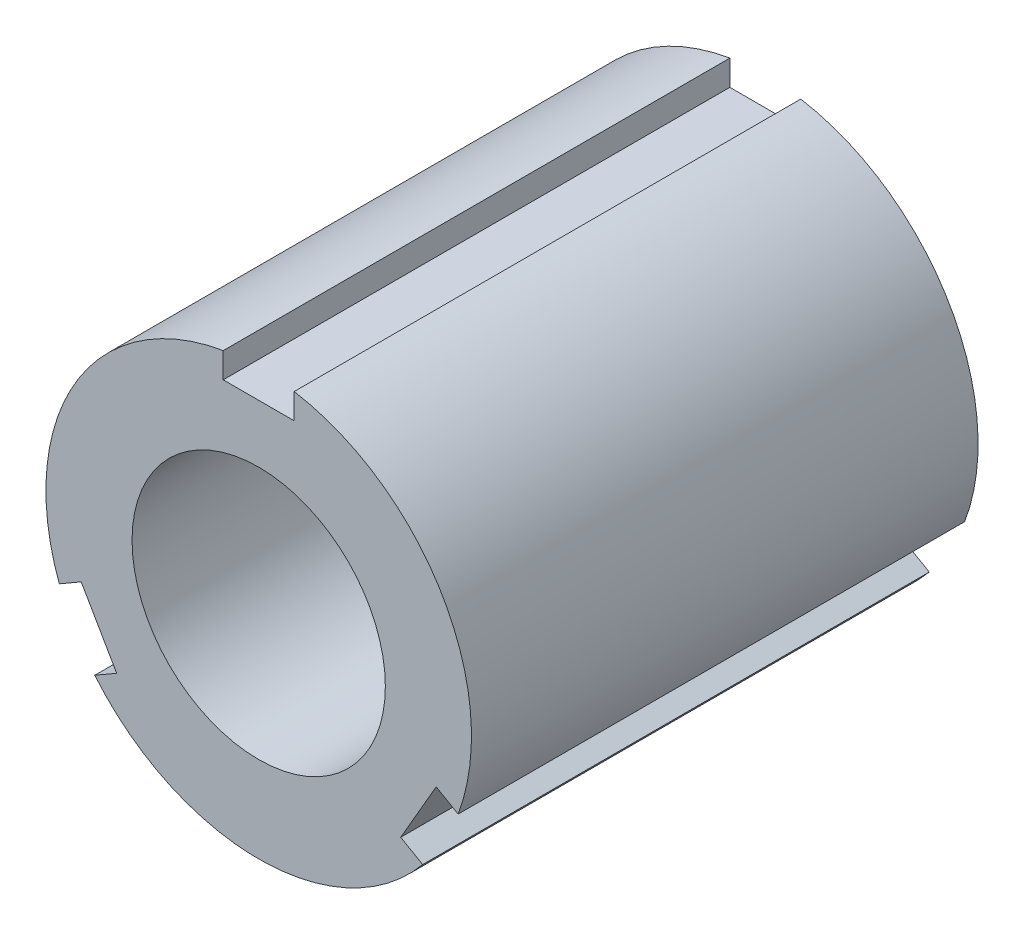
ISO-10303-21;
HEADER;
FILE_DESCRIPTION(('STEP AP214'),'2;1');
FILE_NAME('part.step','',(''),(''),'','','');
FILE_SCHEMA(('AUTOMOTIVE_DESIGN { 1 0 10303 214 1 1 1 1 }'));
ENDSEC;
DATA;
#1=APPLICATION_CONTEXT('core data for automotive mechanical design processes');
#2=APPLICATION_PROTOCOL_DEFINITION('international standard','automotive_design',2000,#1);
#3=PRODUCT_CONTEXT('',#1,'mechanical');
#4=PRODUCT('Part','Part','',(#3));
#5=PRODUCT_RELATED_PRODUCT_CATEGORY('part','',(#4));
#6=PRODUCT_DEFINITION_FORMATION('','',#4);
#7=PRODUCT_DEFINITION_CONTEXT('part definition',#1,'design');
#8=PRODUCT_DEFINITION('design','',#6,#7);
#9=PRODUCT_DEFINITION_SHAPE('','',#8);
#10=(LENGTH_UNIT() NAMED_UNIT(*) SI_UNIT(.MILLI.,.METRE.));
#11=(NAMED_UNIT(*) PLANE_ANGLE_UNIT() SI_UNIT($,.RADIAN.));
#12=(NAMED_UNIT(*) SI_UNIT($,.STERADIAN.) SOLID_ANGLE_UNIT());
#13=UNCERTAINTY_MEASURE_WITH_UNIT(LENGTH_MEASURE(1.E-05),#10,'distance_accuracy_value','');
#14=(GEOMETRIC_REPRESENTATION_CONTEXT(3) GLOBAL_UNCERTAINTY_ASSIGNED_CONTEXT((#13)) GLOBAL_UNIT_ASSIGNED_CONTEXT((#10,
#11,#12)) REPRESENTATION_CONTEXT('',''));
#15=CARTESIAN_POINT('',(0.,0.,0.));
#16=DIRECTION('',(0.,0.,1.));
#17=DIRECTION('',(1.,0.,0.));
#18=AXIS2_PLACEMENT_3D('',#15,#16,#17);
#19=CARTESIAN_POINT('',(-3.5,0.,50.));
#20=DIRECTION('',(1.,0.,0.));
#21=DIRECTION('',(0.,1.,0.));
#22=AXIS2_PLACEMENT_3D('',#19,#20,#21);
#23=PLANE('',#22);
#24=DIRECTION('',(0.,-1.,0.));
#25=VECTOR('',#24,1.);
#26=CARTESIAN_POINT('',(-3.5,0.,0.));
#27=LINE('',#26,#25);
#28=CARTESIAN_POINT('',(-3.5,20.7062792408487,0.));
#29=VERTEX_POINT('',#28);
#30=CARTESIAN_POINT('',(-3.5,18.2062792408487,0.));
#31=VERTEX_POINT('',#30);
#32=EDGE_CURVE('E205',#29,#31,#27,.T.);
#33=ORIENTED_EDGE('',*,*,#32,.F.);
#34=DIRECTION('',(0.,0.,-1.));
#35=VECTOR('',#34,1.);
#36=CARTESIAN_POINT('',(-3.5,20.7062792408487,50.));
#37=LINE('',#36,#35);
#38=CARTESIAN_POINT('',(-3.5,20.7062792408487,50.));
#39=VERTEX_POINT('',#38);
#40=EDGE_CURVE('E11',#39,#29,#37,.T.);
#41=ORIENTED_EDGE('',*,*,#40,.F.);
#42=DIRECTION('',(0.,-1.,0.));
#43=VECTOR('',#42,1.);
#44=CARTESIAN_POINT('',(-3.5,0.,50.));
#45=LINE('',#44,#43);
#46=CARTESIAN_POINT('',(-3.5,18.2062792408487,50.));
#47=VERTEX_POINT('',#46);
#48=EDGE_CURVE('E306',#39,#47,#45,.T.);
#49=ORIENTED_EDGE('',*,*,#48,.T.);
#50=DIRECTION('',(0.,0.,-1.));
#51=VECTOR('',#50,1.);
#52=CARTESIAN_POINT('',(-3.5,18.2062792408487,50.));
#53=LINE('',#52,#51);
#54=EDGE_CURVE('E59',#47,#31,#53,.T.);
#55=ORIENTED_EDGE('',*,*,#54,.T.);
#56=EDGE_LOOP('',(#33,#41,#49,#55));
#57=FACE_BOUND('',#56,.T.);
#58=ADVANCED_FACE('F41',(#57),#23,.T.);
#59=CARTESIAN_POINT('',(0.,0.,50.));
#60=DIRECTION('',(0.,0.,-1.));
#61=DIRECTION('',(-1.,0.,0.));
#62=AXIS2_PLACEMENT_3D('',#59,#60,#61);
#63=CYLINDRICAL_SURFACE('',#62,21.);
#64=CARTESIAN_POINT('',(0.,0.,0.));
#65=DIRECTION('',(0.,0.,1.));
#66=DIRECTION('',(1.,0.,0.));
#67=AXIS2_PLACEMENT_3D('',#64,#65,#66);
#68=CIRCLE('',#67,21.);
#69=CARTESIAN_POINT('',(-19.682163840428,-7.32205070717927,0.));
#70=VERTEX_POINT('',#69);
#71=EDGE_CURVE('E201',#29,#70,#68,.T.);
#72=ORIENTED_EDGE('',*,*,#71,.T.);
#73=DIRECTION('',(0.,0.,-1.));
#74=VECTOR('',#73,1.);
#75=CARTESIAN_POINT('',(-19.682163840428,-7.32205070717927,50.));
#76=LINE('',#75,#74);
#77=CARTESIAN_POINT('',(-19.682163840428,-7.32205070717927,50.));
#78=VERTEX_POINT('',#77);
#79=EDGE_CURVE('E51',#78,#70,#76,.T.);
#80=ORIENTED_EDGE('',*,*,#79,.F.);
#81=CARTESIAN_POINT('',(0.,0.,50.));
#82=DIRECTION('',(0.,0.,1.));
#83=DIRECTION('',(1.,0.,0.));
#84=AXIS2_PLACEMENT_3D('',#81,#82,#83);
#85=CIRCLE('',#84,21.);
#86=EDGE_CURVE('E156',#39,#78,#85,.T.);
#87=ORIENTED_EDGE('',*,*,#86,.F.);
#88=ORIENTED_EDGE('',*,*,#40,.T.);
#89=EDGE_LOOP('',(#72,#80,#87,#88));
#90=FACE_BOUND('',#89,.T.);
#91=ADVANCED_FACE('F202',(#90),#63,.T.);
#92=CARTESIAN_POINT('',(-1.74999999999949,3.03108891324464,50.));
#93=DIRECTION('',(-0.500000000000001,0.866025403784438,0.));
#94=DIRECTION('',(-0.866025403784438,-0.500000000000001,0.));
#95=AXIS2_PLACEMENT_3D('',#92,#93,#94);
#96=PLANE('',#95);
#97=DIRECTION('',(0.866025403784438,0.500000000000001,0.));
#98=VECTOR('',#97,1.);
#99=CARTESIAN_POINT('',(-1.74999999999949,3.03108891324464,0.));
#100=LINE('',#99,#98);
#101=CARTESIAN_POINT('',(-17.5171003309669,-6.07205070717926,0.));
#102=VERTEX_POINT('',#101);
#103=EDGE_CURVE('E195',#70,#102,#100,.T.);
#104=ORIENTED_EDGE('',*,*,#103,.T.);
#105=DIRECTION('',(0.,0.,-1.));
#106=VECTOR('',#105,1.);
#107=CARTESIAN_POINT('',(-17.5171003309669,-6.07205070717926,50.));
#108=LINE('',#107,#106);
#109=CARTESIAN_POINT('',(-17.5171003309669,-6.07205070717926,50.));
#110=VERTEX_POINT('',#109);
#111=EDGE_CURVE('E185',#110,#102,#108,.T.);
#112=ORIENTED_EDGE('',*,*,#111,.F.);
#113=DIRECTION('',(0.866025403784438,0.500000000000001,0.));
#114=VECTOR('',#113,1.);
#115=CARTESIAN_POINT('',(-1.74999999999949,3.03108891324464,50.));
#116=LINE('',#115,#114);
#117=EDGE_CURVE('E197',#78,#110,#116,.T.);
#118=ORIENTED_EDGE('',*,*,#117,.F.);
#119=ORIENTED_EDGE('',*,*,#79,.T.);
#120=EDGE_LOOP('',(#104,#112,#118,#119));
#121=FACE_BOUND('',#120,.T.);
#122=ADVANCED_FACE('F193',(#121),#96,.F.);
#123=CARTESIAN_POINT('',(-15.7671003309674,-9.1031396204239,50.));
#124=DIRECTION('',(-0.866025403784438,-0.500000000000001,0.));
#125=DIRECTION('',(0.500000000000001,-0.866025403784438,0.));
#126=AXIS2_PLACEMENT_3D('',#123,#124,#125);
#127=PLANE('',#126);
#128=DIRECTION('',(-0.500000000000001,0.866025403784438,0.));
#129=VECTOR('',#128,1.);
#130=CARTESIAN_POINT('',(-15.7671003309674,-9.1031396204239,0.));
#131=LINE('',#130,#129);
#132=CARTESIAN_POINT('',(-14.0171003309669,-12.1342285336703,0.));
#133=VERTEX_POINT('',#132);
#134=EDGE_CURVE('E210',#133,#102,#131,.T.);
#135=ORIENTED_EDGE('',*,*,#134,.F.);
#136=DIRECTION('',(0.,0.,-1.));
#137=VECTOR('',#136,1.);
#138=CARTESIAN_POINT('',(-14.0171003309669,-12.1342285336703,50.));
#139=LINE('',#138,#137);
#140=CARTESIAN_POINT('',(-14.0171003309669,-12.1342285336703,50.));
#141=VERTEX_POINT('',#140);
#142=EDGE_CURVE('E182',#141,#133,#139,.T.);
#143=ORIENTED_EDGE('',*,*,#142,.F.);
#144=DIRECTION('',(-0.500000000000001,0.866025403784438,0.));
#145=VECTOR('',#144,1.);
#146=CARTESIAN_POINT('',(-15.7671003309674,-9.1031396204239,50.));
#147=LINE('',#146,#145);
#148=EDGE_CURVE('E314',#141,#110,#147,.T.);
#149=ORIENTED_EDGE('',*,*,#148,.T.);
#150=ORIENTED_EDGE('',*,*,#111,.T.);
#151=EDGE_LOOP('',(#135,#143,#149,#150));
#152=FACE_BOUND('',#151,.T.);
#153=ADVANCED_FACE('F277',(#152),#127,.T.);
#154=CARTESIAN_POINT('',(1.75000000000052,-3.03108891324644,50.));
#155=DIRECTION('',(-0.5,0.866025403784438,0.));
#156=DIRECTION('',(-0.866025403784439,-0.5,0.));
#157=AXIS2_PLACEMENT_3D('',#154,#155,#156);
#158=PLANE('',#157);
#159=DIRECTION('',(0.866025403784439,0.5,0.));
#160=VECTOR('',#159,1.);
#161=CARTESIAN_POINT('',(1.75000000000052,-3.03108891324644,0.));
#162=LINE('',#161,#160);
#163=CARTESIAN_POINT('',(-16.182163840428,-13.3842285336703,0.));
#164=VERTEX_POINT('',#163);
#165=EDGE_CURVE('E220',#164,#133,#162,.T.);
#166=ORIENTED_EDGE('',*,*,#165,.F.);
#167=DIRECTION('',(0.,0.,-1.));
#168=VECTOR('',#167,1.);
#169=CARTESIAN_POINT('',(-16.182163840428,-13.3842285336703,50.));
#170=LINE('',#169,#168);
#171=CARTESIAN_POINT('',(-16.182163840428,-13.3842285336703,50.));
#172=VERTEX_POINT('',#171);
#173=EDGE_CURVE('E179',#172,#164,#170,.T.);
#174=ORIENTED_EDGE('',*,*,#173,.F.);
#175=DIRECTION('',(0.866025403784439,0.5,0.));
#176=VECTOR('',#175,1.);
#177=CARTESIAN_POINT('',(1.75000000000052,-3.03108891324644,50.));
#178=LINE('',#177,#176);
#179=EDGE_CURVE('E318',#172,#141,#178,.T.);
#180=ORIENTED_EDGE('',*,*,#179,.T.);
#181=ORIENTED_EDGE('',*,*,#142,.T.);
#182=EDGE_LOOP('',(#166,#174,#180,#181));
#183=FACE_BOUND('',#182,.T.);
#184=ADVANCED_FACE('F280',(#183),#158,.T.);
#185=CARTESIAN_POINT('',(16.1821638404303,-13.384228533669,0.));
#186=VERTEX_POINT('',#185);
#187=EDGE_CURVE('E207',#164,#186,#68,.T.);
#188=ORIENTED_EDGE('',*,*,#187,.T.);
#189=DIRECTION('',(0.,0.,-1.));
#190=VECTOR('',#189,1.);
#191=CARTESIAN_POINT('',(16.1821638404303,-13.384228533669,50.));
#192=LINE('',#191,#190);
#193=CARTESIAN_POINT('',(16.1821638404303,-13.384228533669,50.));
#194=VERTEX_POINT('',#193);
#195=EDGE_CURVE('E175',#194,#186,#192,.T.);
#196=ORIENTED_EDGE('',*,*,#195,.F.);
#197=EDGE_CURVE('E155',#172,#194,#85,.T.);
#198=ORIENTED_EDGE('',*,*,#197,.F.);
#199=ORIENTED_EDGE('',*,*,#173,.T.);
#200=EDGE_LOOP('',(#188,#196,#198,#199));
#201=FACE_BOUND('',#200,.T.);
#202=ADVANCED_FACE('F273',(#201),#63,.T.);
#203=CARTESIAN_POINT('',(-1.74999999999936,-3.03108891324442,50.));
#204=DIRECTION('',(-0.5,-0.866025403784439,0.));
#205=DIRECTION('',(0.866025403784439,-0.5,0.));
#206=AXIS2_PLACEMENT_3D('',#203,#204,#205);
#207=PLANE('',#206);
#208=DIRECTION('',(-0.866025403784439,0.5,0.));
#209=VECTOR('',#208,1.);
#210=CARTESIAN_POINT('',(-1.74999999999936,-3.03108891324442,0.));
#211=LINE('',#210,#209);
#212=CARTESIAN_POINT('',(14.0171003309692,-12.134228533669,0.));
#213=VERTEX_POINT('',#212);
#214=EDGE_CURVE('E219',#186,#213,#211,.T.);
#215=ORIENTED_EDGE('',*,*,#214,.T.);
#216=DIRECTION('',(0.,0.,-1.));
#217=VECTOR('',#216,1.);
#218=CARTESIAN_POINT('',(14.0171003309692,-12.134228533669,50.));
#219=LINE('',#218,#217);
#220=CARTESIAN_POINT('',(14.0171003309692,-12.134228533669,50.));
#221=VERTEX_POINT('',#220);
#222=EDGE_CURVE('E172',#221,#213,#219,.T.);
#223=ORIENTED_EDGE('',*,*,#222,.F.);
#224=DIRECTION('',(-0.866025403784439,0.5,0.));
#225=VECTOR('',#224,1.);
#226=CARTESIAN_POINT('',(-1.74999999999936,-3.03108891324442,50.));
#227=LINE('',#226,#225);
#228=EDGE_CURVE('E322',#194,#221,#227,.T.);
#229=ORIENTED_EDGE('',*,*,#228,.F.);
#230=ORIENTED_EDGE('',*,*,#195,.T.);
#231=EDGE_LOOP('',(#215,#223,#229,#230));
#232=FACE_BOUND('',#231,.T.);
#233=ADVANCED_FACE('F285',(#232),#207,.F.);
#234=CARTESIAN_POINT('',(15.7671003309686,-9.10313962042455,50.));
#235=DIRECTION('',(0.866025403784439,-0.499999999999999,0.));
#236=DIRECTION('',(0.5,0.866025403784439,0.));
#237=AXIS2_PLACEMENT_3D('',#234,#235,#236);
#238=PLANE('',#237);
#239=DIRECTION('',(-0.5,-0.866025403784439,0.));
#240=VECTOR('',#239,1.);
#241=CARTESIAN_POINT('',(15.7671003309686,-9.10313962042455,0.));
#242=LINE('',#241,#240);
#243=CARTESIAN_POINT('',(17.5171003309692,-6.0720507071779,0.));
#244=VERTEX_POINT('',#243);
#245=EDGE_CURVE('E227',#244,#213,#242,.T.);
#246=ORIENTED_EDGE('',*,*,#245,.F.);
#247=DIRECTION('',(0.,0.,-1.));
#248=VECTOR('',#247,1.);
#249=CARTESIAN_POINT('',(17.5171003309692,-6.0720507071779,50.));
#250=LINE('',#249,#248);
#251=CARTESIAN_POINT('',(17.5171003309692,-6.0720507071779,50.));
#252=VERTEX_POINT('',#251);
#253=EDGE_CURVE('E165',#252,#244,#250,.T.);
#254=ORIENTED_EDGE('',*,*,#253,.F.);
#255=DIRECTION('',(-0.5,-0.866025403784439,0.));
#256=VECTOR('',#255,1.);
#257=CARTESIAN_POINT('',(15.7671003309686,-9.10313962042455,50.));
#258=LINE('',#257,#256);
#259=EDGE_CURVE('E325',#252,#221,#258,.T.);
#260=ORIENTED_EDGE('',*,*,#259,.T.);
#261=ORIENTED_EDGE('',*,*,#222,.T.);
#262=EDGE_LOOP('',(#246,#254,#260,#261));
#263=FACE_BOUND('',#262,.T.);
#264=ADVANCED_FACE('F288',(#263),#238,.T.);
#265=CARTESIAN_POINT('',(1.75000000000064,3.03108891324664,50.));
#266=DIRECTION('',(-0.499999999999999,-0.866025403784439,0.));
#267=DIRECTION('',(0.866025403784439,-0.499999999999999,0.));
#268=AXIS2_PLACEMENT_3D('',#265,#266,#267);
#269=PLANE('',#268);
#270=DIRECTION('',(-0.866025403784439,0.499999999999999,0.));
#271=VECTOR('',#270,1.);
#272=CARTESIAN_POINT('',(1.75000000000064,3.03108891324664,0.));
#273=LINE('',#272,#271);
#274=CARTESIAN_POINT('',(19.6821638404303,-7.3220507071779,0.));
#275=VERTEX_POINT('',#274);
#276=EDGE_CURVE('E216',#275,#244,#273,.T.);
#277=ORIENTED_EDGE('',*,*,#276,.F.);
#278=DIRECTION('',(0.,0.,-1.));
#279=VECTOR('',#278,1.);
#280=CARTESIAN_POINT('',(19.6821638404303,-7.3220507071779,50.));
#281=LINE('',#280,#279);
#282=CARTESIAN_POINT('',(19.6821638404303,-7.3220507071779,50.));
#283=VERTEX_POINT('',#282);
#284=EDGE_CURVE('E161',#283,#275,#281,.T.);
#285=ORIENTED_EDGE('',*,*,#284,.F.);
#286=DIRECTION('',(-0.866025403784439,0.499999999999999,0.));
#287=VECTOR('',#286,1.);
#288=CARTESIAN_POINT('',(1.75000000000064,3.03108891324664,50.));
#289=LINE('',#288,#287);
#290=EDGE_CURVE('E151',#283,#252,#289,.T.);
#291=ORIENTED_EDGE('',*,*,#290,.T.);
#292=ORIENTED_EDGE('',*,*,#253,.T.);
#293=EDGE_LOOP('',(#277,#285,#291,#292));
#294=FACE_BOUND('',#293,.T.);
#295=ADVANCED_FACE('F292',(#294),#269,.T.);
#296=CARTESIAN_POINT('',(3.5,20.7062792408487,0.));
#297=VERTEX_POINT('',#296);
#298=EDGE_CURVE('E159',#275,#297,#68,.T.);
#299=ORIENTED_EDGE('',*,*,#298,.T.);
#300=DIRECTION('',(0.,0.,-1.));
#301=VECTOR('',#300,1.);
#302=CARTESIAN_POINT('',(3.5,20.7062792408487,50.));
#303=LINE('',#302,#301);
#304=CARTESIAN_POINT('',(3.5,20.7062792408487,50.));
#305=VERTEX_POINT('',#304);
#306=EDGE_CURVE('E137',#305,#297,#303,.T.);
#307=ORIENTED_EDGE('',*,*,#306,.F.);
#308=EDGE_CURVE('E143',#283,#305,#85,.T.);
#309=ORIENTED_EDGE('',*,*,#308,.F.);
#310=ORIENTED_EDGE('',*,*,#284,.T.);
#311=EDGE_LOOP('',(#299,#307,#309,#310));
#312=FACE_BOUND('',#311,.T.);
#313=ADVANCED_FACE('F157',(#312),#63,.T.);
#314=CARTESIAN_POINT('',(3.5,0.,50.));
#315=DIRECTION('',(1.,0.,0.));
#316=DIRECTION('',(0.,1.,0.));
#317=AXIS2_PLACEMENT_3D('',#314,#315,#316);
#318=PLANE('',#317);
#319=DIRECTION('',(0.,-1.,0.));
#320=VECTOR('',#319,1.);
#321=CARTESIAN_POINT('',(3.5,0.,0.));
#322=LINE('',#321,#320);
#323=CARTESIAN_POINT('',(3.5,18.2062792408487,0.));
#324=VERTEX_POINT('',#323);
#325=EDGE_CURVE('E215',#297,#324,#322,.T.);
#326=ORIENTED_EDGE('',*,*,#325,.T.);
#327=DIRECTION('',(0.,0.,-1.));
#328=VECTOR('',#327,1.);
#329=CARTESIAN_POINT('',(3.5,18.2062792408487,50.));
#330=LINE('',#329,#328);
#331=CARTESIAN_POINT('',(3.5,18.2062792408487,50.));
#332=VERTEX_POINT('',#331);
#333=EDGE_CURVE('E97',#332,#324,#330,.T.);
#334=ORIENTED_EDGE('',*,*,#333,.F.);
#335=DIRECTION('',(0.,-1.,0.));
#336=VECTOR('',#335,1.);
#337=CARTESIAN_POINT('',(3.5,0.,50.));
#338=LINE('',#337,#336);
#339=EDGE_CURVE('E133',#305,#332,#338,.T.);
#340=ORIENTED_EDGE('',*,*,#339,.F.);
#341=ORIENTED_EDGE('',*,*,#306,.T.);
#342=EDGE_LOOP('',(#326,#334,#340,#341));
#343=FACE_BOUND('',#342,.T.);
#344=ADVANCED_FACE('F135',(#343),#318,.F.);
#345=CARTESIAN_POINT('',(0.,0.,50.));
#346=DIRECTION('',(0.,0.,-1.));
#347=DIRECTION('',(-1.,0.,0.));
#348=AXIS2_PLACEMENT_3D('',#345,#346,#347);
#349=CYLINDRICAL_SURFACE('',#348,12.5);
#350=CARTESIAN_POINT('',(0.,0.,50.));
#351=DIRECTION('',(0.,0.,1.));
#352=DIRECTION('',(1.,0.,0.));
#353=AXIS2_PLACEMENT_3D('',#350,#351,#352);
#354=CIRCLE('',#353,12.5);
#355=CARTESIAN_POINT('',(12.5,0.,50.));
#356=VERTEX_POINT('',#355);
#357=EDGE_CURVE('E246',#356,#356,#354,.T.);
#358=ORIENTED_EDGE('',*,*,#357,.T.);
#359=EDGE_LOOP('',(#358));
#360=FACE_BOUND('',#359,.T.);
#361=CARTESIAN_POINT('',(0.,0.,0.));
#362=DIRECTION('',(0.,0.,1.));
#363=DIRECTION('',(1.,0.,0.));
#364=AXIS2_PLACEMENT_3D('',#361,#362,#363);
#365=CIRCLE('',#364,12.5);
#366=CARTESIAN_POINT('',(12.5,0.,0.));
#367=VERTEX_POINT('',#366);
#368=EDGE_CURVE('E212',#367,#367,#365,.T.);
#369=ORIENTED_EDGE('',*,*,#368,.F.);
#370=EDGE_LOOP('',(#369));
#371=FACE_BOUND('',#370,.T.);
#372=ADVANCED_FACE('F43',(#360,#371),#349,.F.);
#373=CARTESIAN_POINT('',(0.,18.2062792408487,50.));
#374=DIRECTION('',(0.,1.,0.));
#375=DIRECTION('',(0.,0.,1.));
#376=AXIS2_PLACEMENT_3D('',#373,#374,#375);
#377=PLANE('',#376);
#378=DIRECTION('',(1.,0.,0.));
#379=VECTOR('',#378,1.);
#380=CARTESIAN_POINT('',(0.,18.2062792408487,0.));
#381=LINE('',#380,#379);
#382=EDGE_CURVE('E243',#31,#324,#381,.T.);
#383=ORIENTED_EDGE('',*,*,#382,.F.);
#384=ORIENTED_EDGE('',*,*,#54,.F.);
#385=DIRECTION('',(1.,0.,0.));
#386=VECTOR('',#385,1.);
#387=CARTESIAN_POINT('',(0.,18.2062792408487,50.));
#388=LINE('',#387,#386);
#389=EDGE_CURVE('E142',#47,#332,#388,.T.);
#390=ORIENTED_EDGE('',*,*,#389,.T.);
#391=ORIENTED_EDGE('',*,*,#333,.T.);
#392=EDGE_LOOP('',(#383,#384,#390,#391));
#393=FACE_BOUND('',#392,.T.);
#394=ADVANCED_FACE('F259',(#393),#377,.T.);
#395=CARTESIAN_POINT('',(0.,0.,50.));
#396=DIRECTION('',(0.,0.,1.));
#397=DIRECTION('',(1.,0.,0.));
#398=AXIS2_PLACEMENT_3D('',#395,#396,#397);
#399=PLANE('',#398);
#400=ORIENTED_EDGE('',*,*,#357,.F.);
#401=EDGE_LOOP('',(#400));
#402=FACE_BOUND('',#401,.T.);
#403=ORIENTED_EDGE('',*,*,#48,.F.);
#404=ORIENTED_EDGE('',*,*,#86,.T.);
#405=ORIENTED_EDGE('',*,*,#117,.T.);
#406=ORIENTED_EDGE('',*,*,#148,.F.);
#407=ORIENTED_EDGE('',*,*,#179,.F.);
#408=ORIENTED_EDGE('',*,*,#197,.T.);
#409=ORIENTED_EDGE('',*,*,#228,.T.);
#410=ORIENTED_EDGE('',*,*,#259,.F.);
#411=ORIENTED_EDGE('',*,*,#290,.F.);
#412=ORIENTED_EDGE('',*,*,#308,.T.);
#413=ORIENTED_EDGE('',*,*,#339,.T.);
#414=ORIENTED_EDGE('',*,*,#389,.F.);
#415=EDGE_LOOP('',(#403,#404,#405,#406,#407,#408,#409,#410,#411,#412,#413,#414));
#416=FACE_BOUND('',#415,.T.);
#417=ADVANCED_FACE('F148',(#402,#416),#399,.T.);
#418=CARTESIAN_POINT('',(0.,0.,0.));
#419=DIRECTION('',(0.,0.,1.));
#420=DIRECTION('',(1.,0.,0.));
#421=AXIS2_PLACEMENT_3D('',#418,#419,#420);
#422=PLANE('',#421);
#423=ORIENTED_EDGE('',*,*,#368,.T.);
#424=EDGE_LOOP('',(#423));
#425=FACE_BOUND('',#424,.T.);
#426=ORIENTED_EDGE('',*,*,#32,.T.);
#427=ORIENTED_EDGE('',*,*,#382,.T.);
#428=ORIENTED_EDGE('',*,*,#325,.F.);
#429=ORIENTED_EDGE('',*,*,#298,.F.);
#430=ORIENTED_EDGE('',*,*,#276,.T.);
#431=ORIENTED_EDGE('',*,*,#245,.T.);
#432=ORIENTED_EDGE('',*,*,#214,.F.);
#433=ORIENTED_EDGE('',*,*,#187,.F.);
#434=ORIENTED_EDGE('',*,*,#165,.T.);
#435=ORIENTED_EDGE('',*,*,#134,.T.);
#436=ORIENTED_EDGE('',*,*,#103,.F.);
#437=ORIENTED_EDGE('',*,*,#71,.F.);
#438=EDGE_LOOP('',(#426,#427,#428,#429,#430,#431,#432,#433,#434,#435,#436,#437));
#439=FACE_BOUND('',#438,.T.);
#440=ADVANCED_FACE('F256',(#425,#439),#422,.F.);
#441=CLOSED_SHELL('',(#58,#91,#122,#153,#184,#202,#233,#264,#295,#313,#344,#372,#394,#417,#440));
#442=MANIFOLD_SOLID_BREP('B2',#441);
#443=ADVANCED_BREP_SHAPE_REPRESENTATION('',(#18,#442),#14);
#444=SHAPE_DEFINITION_REPRESENTATION(#9,#443);
ENDSEC;
END-ISO-10303-21;
